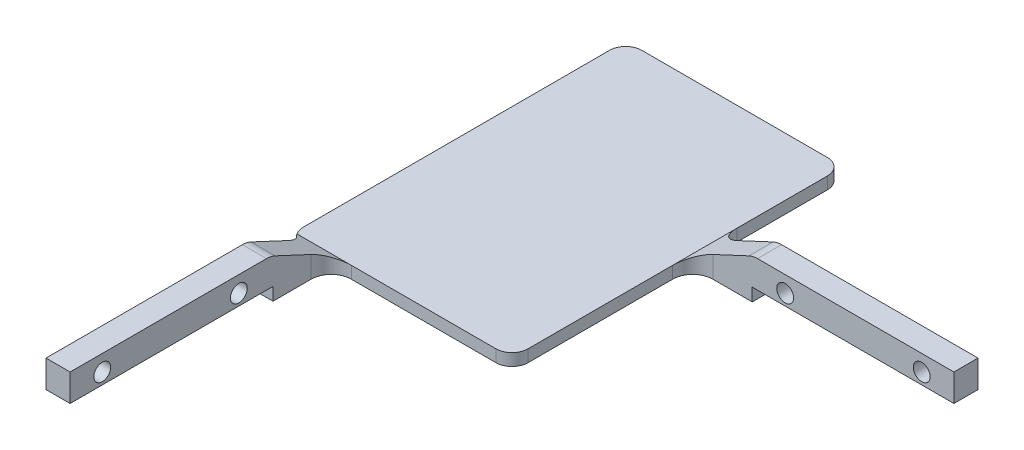
ISO-10303-21;
HEADER;
FILE_DESCRIPTION(('STEP AP214'),'2;1');
FILE_NAME('part.step','',(''),(''),'','','');
FILE_SCHEMA(('AUTOMOTIVE_DESIGN { 1 0 10303 214 1 1 1 1 }'));
ENDSEC;
DATA;
#1=APPLICATION_CONTEXT('core data for automotive mechanical design processes');
#2=APPLICATION_PROTOCOL_DEFINITION('international standard','automotive_design',2000,#1);
#3=PRODUCT_CONTEXT('',#1,'mechanical');
#4=PRODUCT('Part','Part','',(#3));
#5=PRODUCT_RELATED_PRODUCT_CATEGORY('part','',(#4));
#6=PRODUCT_DEFINITION_FORMATION('','',#4);
#7=PRODUCT_DEFINITION_CONTEXT('part definition',#1,'design');
#8=PRODUCT_DEFINITION('design','',#6,#7);
#9=PRODUCT_DEFINITION_SHAPE('','',#8);
#10=(LENGTH_UNIT() NAMED_UNIT(*) SI_UNIT(.MILLI.,.METRE.));
#11=(NAMED_UNIT(*) PLANE_ANGLE_UNIT() SI_UNIT($,.RADIAN.));
#12=(NAMED_UNIT(*) SI_UNIT($,.STERADIAN.) SOLID_ANGLE_UNIT());
#13=UNCERTAINTY_MEASURE_WITH_UNIT(LENGTH_MEASURE(1.E-05),#10,'distance_accuracy_value','');
#14=(GEOMETRIC_REPRESENTATION_CONTEXT(3) GLOBAL_UNCERTAINTY_ASSIGNED_CONTEXT((#13)) GLOBAL_UNIT_ASSIGNED_CONTEXT((#10,
#11,#12)) REPRESENTATION_CONTEXT('',''));
#15=CARTESIAN_POINT('',(0.,0.,0.));
#16=DIRECTION('',(0.,0.,1.));
#17=DIRECTION('',(1.,0.,0.));
#18=AXIS2_PLACEMENT_3D('',#15,#16,#17);
#19=CARTESIAN_POINT('',(0.,-85.2023912995869,0.));
#20=DIRECTION('',(0.,-1.,0.));
#21=DIRECTION('',(0.,0.,-1.));
#22=AXIS2_PLACEMENT_3D('',#19,#20,#21);
#23=PLANE('',#22);
#24=CARTESIAN_POINT('',(-96.,-85.2023912995869,-35.3352384841235));
#25=DIRECTION('',(0.,-1.,0.));
#26=DIRECTION('',(0.,0.,-1.));
#27=AXIS2_PLACEMENT_3D('',#24,#25,#26);
#28=CIRCLE('',#27,5.);
#29=CARTESIAN_POINT('',(-91.,-85.2023912995869,-35.3352384841235));
#30=VERTEX_POINT('',#29);
#31=CARTESIAN_POINT('',(-92.7777777777776,-85.2023912995869,-39.1584941583645));
#32=VERTEX_POINT('',#31);
#33=EDGE_CURVE('E377',#30,#32,#28,.F.);
#34=ORIENTED_EDGE('',*,*,#33,.T.);
#35=CARTESIAN_POINT('',(-90.1999999999996,-85.2023912995869,-42.2170986977573));
#36=DIRECTION('',(0.,-1.,0.));
#37=DIRECTION('',(0.,0.,-1.));
#38=AXIS2_PLACEMENT_3D('',#35,#36,#37);
#39=CIRCLE('',#38,4.);
#40=CARTESIAN_POINT('',(-94.1999999999996,-85.2023912995869,-42.2170986977573));
#41=VERTEX_POINT('',#40);
#42=EDGE_CURVE('E439',#32,#41,#39,.T.);
#43=ORIENTED_EDGE('',*,*,#42,.T.);
#44=DIRECTION('',(0.,0.,-1.));
#45=VECTOR('',#44,1.);
#46=CARTESIAN_POINT('',(-94.1999999999996,-85.2023912995869,0.));
#47=LINE('',#46,#45);
#48=CARTESIAN_POINT('',(-94.1999999999996,-85.2023912995869,-118.5));
#49=VERTEX_POINT('',#48);
#50=EDGE_CURVE('E316',#41,#49,#47,.T.);
#51=ORIENTED_EDGE('',*,*,#50,.T.);
#52=CARTESIAN_POINT('',(-90.1999999999996,-85.2023912995869,-118.5));
#53=DIRECTION('',(0.,-1.,0.));
#54=DIRECTION('',(0.,0.,-1.));
#55=AXIS2_PLACEMENT_3D('',#52,#53,#54);
#56=CIRCLE('',#55,4.);
#57=CARTESIAN_POINT('',(-90.1999999999996,-85.2023912995869,-122.5));
#58=VERTEX_POINT('',#57);
#59=EDGE_CURVE('E49',#49,#58,#56,.T.);
#60=ORIENTED_EDGE('',*,*,#59,.T.);
#61=DIRECTION('',(-1.,0.,0.));
#62=VECTOR('',#61,1.);
#63=CARTESIAN_POINT('',(0.,-85.2023912995869,-122.5));
#64=LINE('',#63,#62);
#65=CARTESIAN_POINT('',(-43.9999999999996,-85.2023912995869,-122.5));
#66=VERTEX_POINT('',#65);
#67=EDGE_CURVE('E308',#66,#58,#64,.T.);
#68=ORIENTED_EDGE('',*,*,#67,.F.);
#69=CARTESIAN_POINT('',(-43.9999999999996,-85.2023912995869,-118.5));
#70=DIRECTION('',(0.,-1.,0.));
#71=DIRECTION('',(0.,0.,-1.));
#72=AXIS2_PLACEMENT_3D('',#69,#70,#71);
#73=CIRCLE('',#72,4.);
#74=CARTESIAN_POINT('',(-39.9999999999996,-85.2023912995869,-118.5));
#75=VERTEX_POINT('',#74);
#76=EDGE_CURVE('E434',#66,#75,#73,.T.);
#77=ORIENTED_EDGE('',*,*,#76,.T.);
#78=DIRECTION('',(0.,0.,-1.));
#79=VECTOR('',#78,1.);
#80=CARTESIAN_POINT('',(-39.9999999999996,-85.2023912995869,0.));
#81=LINE('',#80,#79);
#82=CARTESIAN_POINT('',(-39.9999999999996,-85.2023912995869,-96.));
#83=VERTEX_POINT('',#82);
#84=EDGE_CURVE('E317',#83,#75,#81,.T.);
#85=ORIENTED_EDGE('',*,*,#84,.F.);
#86=CARTESIAN_POINT('',(-34.9999999999996,-85.2023912995869,-96.));
#87=DIRECTION('',(0.,-1.,0.));
#88=DIRECTION('',(0.,0.,-1.));
#89=AXIS2_PLACEMENT_3D('',#86,#87,#88);
#90=CIRCLE('',#89,5.);
#91=CARTESIAN_POINT('',(-34.9999999999996,-85.2023912995869,-91.));
#92=VERTEX_POINT('',#91);
#93=EDGE_CURVE('E388',#83,#92,#90,.F.);
#94=ORIENTED_EDGE('',*,*,#93,.T.);
#95=DIRECTION('',(1.,0.,0.));
#96=VECTOR('',#95,1.);
#97=CARTESIAN_POINT('',(0.,-85.2023912995869,-91.));
#98=LINE('',#97,#96);
#99=CARTESIAN_POINT('',(-25.1999999999996,-85.2023912995869,-91.));
#100=VERTEX_POINT('',#99);
#101=EDGE_CURVE('E297',#92,#100,#98,.T.);
#102=ORIENTED_EDGE('',*,*,#101,.T.);
#103=DIRECTION('',(0.,0.,1.));
#104=VECTOR('',#103,1.);
#105=CARTESIAN_POINT('',(-25.1999999999996,-85.2023912995869,0.));
#106=LINE('',#105,#104);
#107=CARTESIAN_POINT('',(-25.1999999999996,-85.2023912995869,-85.));
#108=VERTEX_POINT('',#107);
#109=EDGE_CURVE('E321',#100,#108,#106,.T.);
#110=ORIENTED_EDGE('',*,*,#109,.T.);
#111=DIRECTION('',(1.,0.,0.));
#112=VECTOR('',#111,1.);
#113=CARTESIAN_POINT('',(0.,-85.2023912995869,-85.));
#114=LINE('',#113,#112);
#115=CARTESIAN_POINT('',(-34.9999999999996,-85.2023912995869,-85.));
#116=VERTEX_POINT('',#115);
#117=EDGE_CURVE('E322',#116,#108,#114,.T.);
#118=ORIENTED_EDGE('',*,*,#117,.F.);
#119=CARTESIAN_POINT('',(-34.9999999999996,-85.2023912995869,-80.));
#120=DIRECTION('',(0.,-1.,0.));
#121=DIRECTION('',(0.,0.,-1.));
#122=AXIS2_PLACEMENT_3D('',#119,#120,#121);
#123=CIRCLE('',#122,5.);
#124=CARTESIAN_POINT('',(-39.9999999999996,-85.2023912995869,-80.));
#125=VERTEX_POINT('',#124);
#126=EDGE_CURVE('E382',#116,#125,#123,.F.);
#127=ORIENTED_EDGE('',*,*,#126,.T.);
#128=DIRECTION('',(0.,0.,-1.));
#129=VECTOR('',#128,1.);
#130=CARTESIAN_POINT('',(-39.9999999999996,-85.2023912995869,0.));
#131=LINE('',#130,#129);
#132=CARTESIAN_POINT('',(-39.9999999999996,-85.2023912995869,-43.9999999999996));
#133=VERTEX_POINT('',#132);
#134=EDGE_CURVE('E303',#133,#125,#131,.T.);
#135=ORIENTED_EDGE('',*,*,#134,.F.);
#136=CARTESIAN_POINT('',(-43.9999999999996,-85.2023912995869,-43.9999999999996));
#137=DIRECTION('',(0.,-1.,0.));
#138=DIRECTION('',(0.,0.,-1.));
#139=AXIS2_PLACEMENT_3D('',#136,#137,#138);
#140=CIRCLE('',#139,4.);
#141=CARTESIAN_POINT('',(-43.9999999999996,-85.2023912995869,-39.9999999999996));
#142=VERTEX_POINT('',#141);
#143=EDGE_CURVE('E436',#133,#142,#140,.T.);
#144=ORIENTED_EDGE('',*,*,#143,.T.);
#145=DIRECTION('',(-1.,0.,0.));
#146=VECTOR('',#145,1.);
#147=CARTESIAN_POINT('',(0.,-85.2023912995869,-39.9999999999996));
#148=LINE('',#147,#146);
#149=CARTESIAN_POINT('',(-80.,-85.2023912995869,-39.9999999999996));
#150=VERTEX_POINT('',#149);
#151=EDGE_CURVE('E326',#142,#150,#148,.T.);
#152=ORIENTED_EDGE('',*,*,#151,.T.);
#153=CARTESIAN_POINT('',(-80.,-85.2023912995869,-34.9999999999996));
#154=DIRECTION('',(0.,-1.,0.));
#155=DIRECTION('',(0.,0.,-1.));
#156=AXIS2_PLACEMENT_3D('',#153,#154,#155);
#157=CIRCLE('',#156,5.);
#158=CARTESIAN_POINT('',(-85.,-85.2023912995869,-34.9999999999996));
#159=VERTEX_POINT('',#158);
#160=EDGE_CURVE('E373',#150,#159,#157,.F.);
#161=ORIENTED_EDGE('',*,*,#160,.T.);
#162=DIRECTION('',(0.,0.,-1.));
#163=VECTOR('',#162,1.);
#164=CARTESIAN_POINT('',(-85.,-85.2023912995869,0.));
#165=LINE('',#164,#163);
#166=CARTESIAN_POINT('',(-85.,-85.2023912995869,-25.4999999999996));
#167=VERTEX_POINT('',#166);
#168=EDGE_CURVE('E304',#167,#159,#165,.T.);
#169=ORIENTED_EDGE('',*,*,#168,.F.);
#170=DIRECTION('',(-1.,0.,0.));
#171=VECTOR('',#170,1.);
#172=CARTESIAN_POINT('',(0.,-85.2023912995869,-25.4999999999996));
#173=LINE('',#172,#171);
#174=CARTESIAN_POINT('',(-91.,-85.2023912995869,-25.4999999999996));
#175=VERTEX_POINT('',#174);
#176=EDGE_CURVE('E291',#167,#175,#173,.T.);
#177=ORIENTED_EDGE('',*,*,#176,.T.);
#178=DIRECTION('',(0.,0.,-1.));
#179=VECTOR('',#178,1.);
#180=CARTESIAN_POINT('',(-91.,-85.2023912995869,0.));
#181=LINE('',#180,#179);
#182=EDGE_CURVE('E328',#175,#30,#181,.T.);
#183=ORIENTED_EDGE('',*,*,#182,.T.);
#184=EDGE_LOOP('',(#34,#43,#51,#60,#68,#77,#85,#94,#102,#110,#118,#127,#135,#144,#152,#161,#169,
#177,#183));
#185=FACE_BOUND('',#184,.T.);
#186=ADVANCED_FACE('F34',(#185),#23,.T.);
#187=CARTESIAN_POINT('',(0.,-82.2023912995869,0.));
#188=DIRECTION('',(0.,1.,0.));
#189=DIRECTION('',(0.,0.,1.));
#190=AXIS2_PLACEMENT_3D('',#187,#188,#189);
#191=PLANE('',#190);
#192=DIRECTION('',(0.,0.,-1.));
#193=VECTOR('',#192,1.);
#194=CARTESIAN_POINT('',(-94.1999999999996,-82.2023912995869,0.));
#195=LINE('',#194,#193);
#196=CARTESIAN_POINT('',(-94.1999999999996,-82.2023912995869,-42.2170986977573));
#197=VERTEX_POINT('',#196);
#198=CARTESIAN_POINT('',(-94.1999999999996,-82.2023912995869,-118.5));
#199=VERTEX_POINT('',#198);
#200=EDGE_CURVE('E305',#197,#199,#195,.T.);
#201=ORIENTED_EDGE('',*,*,#200,.F.);
#202=CARTESIAN_POINT('',(-90.1999999999996,-82.2023912995869,-42.2170986977573));
#203=DIRECTION('',(0.,1.,0.));
#204=DIRECTION('',(0.,0.,1.));
#205=AXIS2_PLACEMENT_3D('',#202,#203,#204);
#206=CIRCLE('',#205,4.);
#207=CARTESIAN_POINT('',(-93.5293352736543,-82.2023912995869,-39.9999999999996));
#208=VERTEX_POINT('',#207);
#209=EDGE_CURVE('E428',#197,#208,#206,.T.);
#210=ORIENTED_EDGE('',*,*,#209,.T.);
#211=DIRECTION('',(-1.,0.,0.));
#212=VECTOR('',#211,1.);
#213=CARTESIAN_POINT('',(0.,-82.2023912995869,-39.9999999999996));
#214=LINE('',#213,#212);
#215=CARTESIAN_POINT('',(-80.,-82.2023912995869,-39.9999999999996));
#216=VERTEX_POINT('',#215);
#217=EDGE_CURVE('E295',#216,#208,#214,.T.);
#218=ORIENTED_EDGE('',*,*,#217,.F.);
#219=DIRECTION('',(-1.,0.,0.));
#220=VECTOR('',#219,1.);
#221=CARTESIAN_POINT('',(0.,-82.2023912995869,-39.9999999999996));
#222=LINE('',#221,#220);
#223=CARTESIAN_POINT('',(-43.9999999999996,-82.2023912995869,-39.9999999999996));
#224=VERTEX_POINT('',#223);
#225=EDGE_CURVE('E301',#224,#216,#222,.T.);
#226=ORIENTED_EDGE('',*,*,#225,.F.);
#227=CARTESIAN_POINT('',(-43.9999999999996,-82.2023912995869,-43.9999999999996));
#228=DIRECTION('',(0.,1.,0.));
#229=DIRECTION('',(0.,0.,1.));
#230=AXIS2_PLACEMENT_3D('',#227,#228,#229);
#231=CIRCLE('',#230,4.);
#232=CARTESIAN_POINT('',(-39.9999999999996,-82.2023912995869,-43.9999999999996));
#233=VERTEX_POINT('',#232);
#234=EDGE_CURVE('E424',#224,#233,#231,.T.);
#235=ORIENTED_EDGE('',*,*,#234,.T.);
#236=DIRECTION('',(0.,0.,-1.));
#237=VECTOR('',#236,1.);
#238=CARTESIAN_POINT('',(-39.9999999999996,-82.2023912995869,0.));
#239=LINE('',#238,#237);
#240=CARTESIAN_POINT('',(-39.9999999999996,-82.2023912995869,-80.));
#241=VERTEX_POINT('',#240);
#242=EDGE_CURVE('E312',#233,#241,#239,.T.);
#243=ORIENTED_EDGE('',*,*,#242,.T.);
#244=DIRECTION('',(0.,0.,-1.));
#245=VECTOR('',#244,1.);
#246=CARTESIAN_POINT('',(-39.9999999999996,-82.2023912995869,0.));
#247=LINE('',#246,#245);
#248=CARTESIAN_POINT('',(-39.9999999999996,-82.2023912995869,-96.));
#249=VERTEX_POINT('',#248);
#250=EDGE_CURVE('E233',#241,#249,#247,.T.);
#251=ORIENTED_EDGE('',*,*,#250,.T.);
#252=CARTESIAN_POINT('',(-39.9999999999996,-82.2023912995869,-118.5));
#253=VERTEX_POINT('',#252);
#254=EDGE_CURVE('E313',#249,#253,#239,.T.);
#255=ORIENTED_EDGE('',*,*,#254,.T.);
#256=CARTESIAN_POINT('',(-43.9999999999996,-82.2023912995869,-118.5));
#257=DIRECTION('',(0.,1.,0.));
#258=DIRECTION('',(0.,0.,1.));
#259=AXIS2_PLACEMENT_3D('',#256,#257,#258);
#260=CIRCLE('',#259,4.);
#261=CARTESIAN_POINT('',(-43.9999999999996,-82.2023912995869,-122.5));
#262=VERTEX_POINT('',#261);
#263=EDGE_CURVE('E422',#253,#262,#260,.T.);
#264=ORIENTED_EDGE('',*,*,#263,.T.);
#265=DIRECTION('',(-1.,0.,0.));
#266=VECTOR('',#265,1.);
#267=CARTESIAN_POINT('',(0.,-82.2023912995869,-122.5));
#268=LINE('',#267,#266);
#269=CARTESIAN_POINT('',(-90.1999999999996,-82.2023912995869,-122.5));
#270=VERTEX_POINT('',#269);
#271=EDGE_CURVE('E309',#262,#270,#268,.T.);
#272=ORIENTED_EDGE('',*,*,#271,.T.);
#273=CARTESIAN_POINT('',(-90.1999999999996,-82.2023912995869,-118.5));
#274=DIRECTION('',(0.,1.,0.));
#275=DIRECTION('',(0.,0.,1.));
#276=AXIS2_PLACEMENT_3D('',#273,#274,#275);
#277=CIRCLE('',#276,4.);
#278=EDGE_CURVE('E426',#270,#199,#277,.T.);
#279=ORIENTED_EDGE('',*,*,#278,.T.);
#280=EDGE_LOOP('',(#201,#210,#218,#226,#235,#243,#251,#255,#264,#272,#279));
#281=FACE_BOUND('',#280,.T.);
#282=ADVANCED_FACE('F466',(#281),#191,.T.);
#283=CARTESIAN_POINT('',(-39.9999999999996,-197.161414906238,0.));
#284=DIRECTION('',(1.,0.,0.));
#285=DIRECTION('',(0.,0.,-1.));
#286=AXIS2_PLACEMENT_3D('',#283,#284,#285);
#287=PLANE('',#286);
#288=ORIENTED_EDGE('',*,*,#84,.T.);
#289=DIRECTION('',(0.,1.,0.));
#290=VECTOR('',#289,1.);
#291=CARTESIAN_POINT('',(-39.9999999999996,-197.161414906238,-118.5));
#292=LINE('',#291,#290);
#293=EDGE_CURVE('E11',#75,#253,#292,.T.);
#294=ORIENTED_EDGE('',*,*,#293,.T.);
#295=ORIENTED_EDGE('',*,*,#254,.F.);
#296=DIRECTION('',(0.,1.,0.));
#297=VECTOR('',#296,1.);
#298=CARTESIAN_POINT('',(-39.9999999999996,-197.161414906238,-96.));
#299=LINE('',#298,#297);
#300=EDGE_CURVE('E359',#249,#83,#299,.F.);
#301=ORIENTED_EDGE('',*,*,#300,.T.);
#302=EDGE_LOOP('',(#288,#294,#295,#301));
#303=FACE_BOUND('',#302,.T.);
#304=ADVANCED_FACE('F512',(#303),#287,.T.);
#305=CARTESIAN_POINT('',(0.,-197.161414906238,-122.5));
#306=DIRECTION('',(0.,0.,-1.));
#307=DIRECTION('',(-1.,0.,0.));
#308=AXIS2_PLACEMENT_3D('',#305,#306,#307);
#309=PLANE('',#308);
#310=ORIENTED_EDGE('',*,*,#67,.T.);
#311=DIRECTION('',(0.,1.,0.));
#312=VECTOR('',#311,1.);
#313=CARTESIAN_POINT('',(-90.1999999999996,-82.2023912995869,-122.5));
#314=LINE('',#313,#312);
#315=EDGE_CURVE('E442',#58,#270,#314,.T.);
#316=ORIENTED_EDGE('',*,*,#315,.T.);
#317=ORIENTED_EDGE('',*,*,#271,.F.);
#318=DIRECTION('',(0.,1.,0.));
#319=VECTOR('',#318,1.);
#320=CARTESIAN_POINT('',(-43.9999999999996,-197.161414906238,-122.5));
#321=LINE('',#320,#319);
#322=EDGE_CURVE('E56',#262,#66,#321,.F.);
#323=ORIENTED_EDGE('',*,*,#322,.T.);
#324=EDGE_LOOP('',(#310,#316,#317,#323));
#325=FACE_BOUND('',#324,.T.);
#326=ADVANCED_FACE('F506',(#325),#309,.T.);
#327=CARTESIAN_POINT('',(-94.1999999999996,-197.161414906238,0.));
#328=DIRECTION('',(1.,0.,0.));
#329=DIRECTION('',(0.,0.,-1.));
#330=AXIS2_PLACEMENT_3D('',#327,#328,#329);
#331=PLANE('',#330);
#332=ORIENTED_EDGE('',*,*,#50,.F.);
#333=DIRECTION('',(0.,-1.,0.));
#334=VECTOR('',#333,1.);
#335=CARTESIAN_POINT('',(-94.1999999999996,-197.161414906238,-42.2170986977573));
#336=LINE('',#335,#334);
#337=EDGE_CURVE('E419',#41,#197,#336,.F.);
#338=ORIENTED_EDGE('',*,*,#337,.T.);
#339=ORIENTED_EDGE('',*,*,#200,.T.);
#340=DIRECTION('',(0.,1.,0.));
#341=VECTOR('',#340,1.);
#342=CARTESIAN_POINT('',(-94.1999999999996,-85.2023912995869,-118.5));
#343=LINE('',#342,#341);
#344=EDGE_CURVE('E390',#199,#49,#343,.F.);
#345=ORIENTED_EDGE('',*,*,#344,.T.);
#346=EDGE_LOOP('',(#332,#338,#339,#345));
#347=FACE_BOUND('',#346,.T.);
#348=ADVANCED_FACE('F501',(#347),#331,.F.);
#349=CARTESIAN_POINT('',(-91.,-197.161414906238,0.));
#350=DIRECTION('',(1.,0.,0.));
#351=DIRECTION('',(0.,0.,-1.));
#352=AXIS2_PLACEMENT_3D('',#349,#350,#351);
#353=PLANE('',#352);
#354=DIRECTION('',(0.,0.422885465331124,0.906183139995265));
#355=VECTOR('',#354,1.);
#356=CARTESIAN_POINT('',(-91.,-82.2023912995869,-39.9999999999996));
#357=LINE('',#356,#355);
#358=CARTESIAN_POINT('',(-91.,-80.0255025921781,-35.3352384841235));
#359=VERTEX_POINT('',#358);
#360=CARTESIAN_POINT('',(-91.,-75.6714755996106,-26.0051806429075));
#361=VERTEX_POINT('',#360);
#362=EDGE_CURVE('E543',#359,#361,#357,.T.);
#363=ORIENTED_EDGE('',*,*,#362,.F.);
#364=DIRECTION('',(0.,-1.,0.));
#365=VECTOR('',#364,1.);
#366=CARTESIAN_POINT('',(-91.,-197.161414906238,-35.3352384841235));
#367=LINE('',#366,#365);
#368=EDGE_CURVE('E346',#359,#30,#367,.T.);
#369=ORIENTED_EDGE('',*,*,#368,.T.);
#370=ORIENTED_EDGE('',*,*,#182,.F.);
#371=DIRECTION('',(0.,1.,0.));
#372=VECTOR('',#371,1.);
#373=CARTESIAN_POINT('',(-91.,-197.161414906238,-25.4999999999996));
#374=LINE('',#373,#372);
#375=CARTESIAN_POINT('',(-91.,-82.0023912995869,-25.4999999999996));
#376=VERTEX_POINT('',#375);
#377=EDGE_CURVE('E408',#175,#376,#374,.T.);
#378=ORIENTED_EDGE('',*,*,#377,.T.);
#379=DIRECTION('',(0.,0.,-1.));
#380=VECTOR('',#379,1.);
#381=CARTESIAN_POINT('',(-91.,-82.0023912995869,0.));
#382=LINE('',#381,#380);
#383=CARTESIAN_POINT('',(-91.,-82.0023912995869,24.9999999999996));
#384=VERTEX_POINT('',#383);
#385=EDGE_CURVE('E411',#384,#376,#382,.T.);
#386=ORIENTED_EDGE('',*,*,#385,.F.);
#387=DIRECTION('',(0.,-1.,0.));
#388=VECTOR('',#387,1.);
#389=CARTESIAN_POINT('',(-91.,-8.93022519646421,24.9999999999996));
#390=LINE('',#389,#388);
#391=CARTESIAN_POINT('',(-91.,-75.2023912995869,24.9999999999996));
#392=VERTEX_POINT('',#391);
#393=EDGE_CURVE('E285',#392,#384,#390,.T.);
#394=ORIENTED_EDGE('',*,*,#393,.F.);
#395=DIRECTION('',(0.,0.,1.));
#396=VECTOR('',#395,1.);
#397=CARTESIAN_POINT('',(-91.,-75.2023912995869,0.));
#398=LINE('',#397,#396);
#399=CARTESIAN_POINT('',(-91.,-75.2023912995869,-23.8907533162518));
#400=VERTEX_POINT('',#399);
#401=EDGE_CURVE('E294',#400,#392,#398,.T.);
#402=ORIENTED_EDGE('',*,*,#401,.F.);
#403=CARTESIAN_POINT('',(-91.,-80.2023912995869,-23.8907533162518));
#404=DIRECTION('',(1.,0.,0.));
#405=DIRECTION('',(0.,0.,-1.));
#406=AXIS2_PLACEMENT_3D('',#403,#404,#405);
#407=CIRCLE('',#406,5.);
#408=EDGE_CURVE('E344',#400,#361,#407,.F.);
#409=ORIENTED_EDGE('',*,*,#408,.T.);
#410=EDGE_LOOP('',(#363,#369,#370,#378,#386,#394,#402,#409));
#411=FACE_BOUND('',#410,.T.);
#412=CARTESIAN_POINT('',(-91.,-79.2023912995869,-17.0000000000003));
#413=DIRECTION('',(-1.,0.,0.));
#414=DIRECTION('',(0.,0.,1.));
#415=AXIS2_PLACEMENT_3D('',#412,#413,#414);
#416=CIRCLE('',#415,2.1);
#417=CARTESIAN_POINT('',(-91.,-79.2023912995869,-14.9000000000003));
#418=VERTEX_POINT('',#417);
#419=EDGE_CURVE('E271',#418,#418,#416,.T.);
#420=ORIENTED_EDGE('',*,*,#419,.F.);
#421=EDGE_LOOP('',(#420));
#422=FACE_BOUND('',#421,.T.);
#423=CARTESIAN_POINT('',(-91.,-79.2023912995869,16.9999999999997));
#424=DIRECTION('',(-1.,0.,0.));
#425=DIRECTION('',(0.,0.,1.));
#426=AXIS2_PLACEMENT_3D('',#423,#424,#425);
#427=CIRCLE('',#426,2.1);
#428=CARTESIAN_POINT('',(-91.,-79.2023912995869,19.0999999999997));
#429=VERTEX_POINT('',#428);
#430=EDGE_CURVE('E268',#429,#429,#427,.T.);
#431=ORIENTED_EDGE('',*,*,#430,.F.);
#432=EDGE_LOOP('',(#431));
#433=FACE_BOUND('',#432,.T.);
#434=ADVANCED_FACE('F566',(#411,#422,#433),#353,.F.);
#435=CARTESIAN_POINT('',(-85.,-197.161414906238,0.));
#436=DIRECTION('',(1.,0.,0.));
#437=DIRECTION('',(0.,0.,-1.));
#438=AXIS2_PLACEMENT_3D('',#435,#436,#437);
#439=PLANE('',#438);
#440=ORIENTED_EDGE('',*,*,#168,.T.);
#441=DIRECTION('',(0.,1.,0.));
#442=VECTOR('',#441,1.);
#443=CARTESIAN_POINT('',(-85.,-197.161414906238,-34.9999999999996));
#444=LINE('',#443,#442);
#445=CARTESIAN_POINT('',(-85.,-79.8690579662536,-34.9999999999996));
#446=VERTEX_POINT('',#445);
#447=EDGE_CURVE('E337',#159,#446,#444,.T.);
#448=ORIENTED_EDGE('',*,*,#447,.T.);
#449=DIRECTION('',(0.,0.422885465331124,0.906183139995265));
#450=VECTOR('',#449,1.);
#451=CARTESIAN_POINT('',(-85.,-82.2023912995869,-39.9999999999996));
#452=LINE('',#451,#450);
#453=CARTESIAN_POINT('',(-85.,-75.6714755996106,-26.0051806429075));
#454=VERTEX_POINT('',#453);
#455=EDGE_CURVE('E473',#446,#454,#452,.T.);
#456=ORIENTED_EDGE('',*,*,#455,.T.);
#457=CARTESIAN_POINT('',(-85.,-80.2023912995869,-23.8907533162518));
#458=DIRECTION('',(1.,0.,0.));
#459=DIRECTION('',(0.,0.,-1.));
#460=AXIS2_PLACEMENT_3D('',#457,#458,#459);
#461=CIRCLE('',#460,5.);
#462=CARTESIAN_POINT('',(-85.,-75.2023912995869,-23.8907533162518));
#463=VERTEX_POINT('',#462);
#464=EDGE_CURVE('E335',#454,#463,#461,.T.);
#465=ORIENTED_EDGE('',*,*,#464,.T.);
#466=DIRECTION('',(0.,0.,1.));
#467=VECTOR('',#466,1.);
#468=CARTESIAN_POINT('',(-85.,-75.2023912995869,0.));
#469=LINE('',#468,#467);
#470=CARTESIAN_POINT('',(-85.,-75.2023912995869,24.9999999999996));
#471=VERTEX_POINT('',#470);
#472=EDGE_CURVE('E292',#463,#471,#469,.T.);
#473=ORIENTED_EDGE('',*,*,#472,.T.);
#474=DIRECTION('',(0.,-1.,0.));
#475=VECTOR('',#474,1.);
#476=CARTESIAN_POINT('',(-85.,-8.93022519646421,24.9999999999996));
#477=LINE('',#476,#475);
#478=CARTESIAN_POINT('',(-85.,-82.0023912995869,24.9999999999996));
#479=VERTEX_POINT('',#478);
#480=EDGE_CURVE('E283',#471,#479,#477,.T.);
#481=ORIENTED_EDGE('',*,*,#480,.T.);
#482=DIRECTION('',(0.,0.,-1.));
#483=VECTOR('',#482,1.);
#484=CARTESIAN_POINT('',(-85.,-82.0023912995869,0.));
#485=LINE('',#484,#483);
#486=CARTESIAN_POINT('',(-85.,-82.0023912995869,-25.4999999999996));
#487=VERTEX_POINT('',#486);
#488=EDGE_CURVE('E278',#479,#487,#485,.T.);
#489=ORIENTED_EDGE('',*,*,#488,.T.);
#490=DIRECTION('',(0.,1.,0.));
#491=VECTOR('',#490,1.);
#492=CARTESIAN_POINT('',(-85.,-197.161414906238,-25.4999999999996));
#493=LINE('',#492,#491);
#494=EDGE_CURVE('E405',#167,#487,#493,.T.);
#495=ORIENTED_EDGE('',*,*,#494,.F.);
#496=EDGE_LOOP('',(#440,#448,#456,#465,#473,#481,#489,#495));
#497=FACE_BOUND('',#496,.T.);
#498=CARTESIAN_POINT('',(-85.,-79.2023912995869,-17.0000000000003));
#499=DIRECTION('',(1.,0.,0.));
#500=DIRECTION('',(0.,0.,-1.));
#501=AXIS2_PLACEMENT_3D('',#498,#499,#500);
#502=CIRCLE('',#501,2.1);
#503=CARTESIAN_POINT('',(-85.,-79.2023912995869,-19.1000000000003));
#504=VERTEX_POINT('',#503);
#505=EDGE_CURVE('E274',#504,#504,#502,.F.);
#506=ORIENTED_EDGE('',*,*,#505,.T.);
#507=EDGE_LOOP('',(#506));
#508=FACE_BOUND('',#507,.T.);
#509=CARTESIAN_POINT('',(-85.,-79.2023912995869,16.9999999999997));
#510=DIRECTION('',(1.,0.,0.));
#511=DIRECTION('',(0.,0.,-1.));
#512=AXIS2_PLACEMENT_3D('',#509,#510,#511);
#513=CIRCLE('',#512,2.1);
#514=CARTESIAN_POINT('',(-85.,-79.2023912995869,14.8999999999997));
#515=VERTEX_POINT('',#514);
#516=EDGE_CURVE('E275',#515,#515,#513,.F.);
#517=ORIENTED_EDGE('',*,*,#516,.T.);
#518=EDGE_LOOP('',(#517));
#519=FACE_BOUND('',#518,.T.);
#520=ADVANCED_FACE('F481',(#497,#508,#519),#439,.T.);
#521=CARTESIAN_POINT('',(0.,-197.161414906238,-39.9999999999996));
#522=DIRECTION('',(0.,0.,-1.));
#523=DIRECTION('',(-1.,0.,0.));
#524=AXIS2_PLACEMENT_3D('',#521,#522,#523);
#525=PLANE('',#524);
#526=ORIENTED_EDGE('',*,*,#151,.F.);
#527=DIRECTION('',(0.,1.,0.));
#528=VECTOR('',#527,1.);
#529=CARTESIAN_POINT('',(-43.9999999999996,-82.2023912995869,-39.9999999999996));
#530=LINE('',#529,#528);
#531=EDGE_CURVE('E445',#142,#224,#530,.T.);
#532=ORIENTED_EDGE('',*,*,#531,.T.);
#533=ORIENTED_EDGE('',*,*,#225,.T.);
#534=DIRECTION('',(0.,1.,0.));
#535=VECTOR('',#534,1.);
#536=CARTESIAN_POINT('',(-80.,-197.161414906238,-39.9999999999996));
#537=LINE('',#536,#535);
#538=EDGE_CURVE('E341',#216,#150,#537,.F.);
#539=ORIENTED_EDGE('',*,*,#538,.T.);
#540=EDGE_LOOP('',(#526,#532,#533,#539));
#541=FACE_BOUND('',#540,.T.);
#542=ADVANCED_FACE('F462',(#541),#525,.F.);
#543=ORIENTED_EDGE('',*,*,#242,.F.);
#544=DIRECTION('',(0.,1.,0.));
#545=VECTOR('',#544,1.);
#546=CARTESIAN_POINT('',(-39.9999999999996,-85.2023912995869,-43.9999999999996));
#547=LINE('',#546,#545);
#548=EDGE_CURVE('E42',#233,#133,#547,.F.);
#549=ORIENTED_EDGE('',*,*,#548,.T.);
#550=ORIENTED_EDGE('',*,*,#134,.T.);
#551=DIRECTION('',(0.,1.,0.));
#552=VECTOR('',#551,1.);
#553=CARTESIAN_POINT('',(-39.9999999999996,-82.2023912995869,-80.));
#554=LINE('',#553,#552);
#555=EDGE_CURVE('E348',#125,#241,#554,.T.);
#556=ORIENTED_EDGE('',*,*,#555,.T.);
#557=EDGE_LOOP('',(#543,#549,#550,#556));
#558=FACE_BOUND('',#557,.T.);
#559=ADVANCED_FACE('F451',(#558),#287,.T.);
#560=CARTESIAN_POINT('',(0.,-197.161414906238,-85.));
#561=DIRECTION('',(0.,0.,1.));
#562=DIRECTION('',(1.,0.,0.));
#563=AXIS2_PLACEMENT_3D('',#560,#561,#562);
#564=PLANE('',#563);
#565=DIRECTION('',(0.906183139995265,0.422885465331124,0.));
#566=VECTOR('',#565,1.);
#567=CARTESIAN_POINT('',(-39.9999999999996,-82.2023912995869,-85.));
#568=LINE('',#567,#566);
#569=CARTESIAN_POINT('',(-34.9999999999996,-79.8690579662536,-85.));
#570=VERTEX_POINT('',#569);
#571=CARTESIAN_POINT('',(-26.0051806429075,-75.6714755996106,-85.));
#572=VERTEX_POINT('',#571);
#573=EDGE_CURVE('E249',#570,#572,#568,.T.);
#574=ORIENTED_EDGE('',*,*,#573,.F.);
#575=DIRECTION('',(0.,1.,0.));
#576=VECTOR('',#575,1.);
#577=CARTESIAN_POINT('',(-34.9999999999996,-85.2023912995869,-85.));
#578=LINE('',#577,#576);
#579=EDGE_CURVE('E353',#570,#116,#578,.F.);
#580=ORIENTED_EDGE('',*,*,#579,.T.);
#581=ORIENTED_EDGE('',*,*,#117,.T.);
#582=DIRECTION('',(0.,1.,0.));
#583=VECTOR('',#582,1.);
#584=CARTESIAN_POINT('',(-25.1999999999996,-197.161414906238,-85.));
#585=LINE('',#584,#583);
#586=CARTESIAN_POINT('',(-25.1999999999996,-82.0023912995869,-85.));
#587=VERTEX_POINT('',#586);
#588=EDGE_CURVE('E324',#108,#587,#585,.T.);
#589=ORIENTED_EDGE('',*,*,#588,.T.);
#590=DIRECTION('',(1.,0.,0.));
#591=VECTOR('',#590,1.);
#592=CARTESIAN_POINT('',(0.,-82.0023912995869,-85.));
#593=LINE('',#592,#591);
#594=CARTESIAN_POINT('',(24.9999999999996,-82.0023912995869,-85.));
#595=VERTEX_POINT('',#594);
#596=EDGE_CURVE('E265',#587,#595,#593,.T.);
#597=ORIENTED_EDGE('',*,*,#596,.T.);
#598=DIRECTION('',(0.,-1.,0.));
#599=VECTOR('',#598,1.);
#600=CARTESIAN_POINT('',(24.9999999999996,-8.93022519646421,-85.));
#601=LINE('',#600,#599);
#602=CARTESIAN_POINT('',(24.9999999999996,-75.2023912995869,-85.));
#603=VERTEX_POINT('',#602);
#604=EDGE_CURVE('E253',#603,#595,#601,.T.);
#605=ORIENTED_EDGE('',*,*,#604,.F.);
#606=DIRECTION('',(-1.,0.,0.));
#607=VECTOR('',#606,1.);
#608=CARTESIAN_POINT('',(0.,-75.2023912995869,-85.));
#609=LINE('',#608,#607);
#610=CARTESIAN_POINT('',(-23.8907533162519,-75.2023912995869,-85.));
#611=VERTEX_POINT('',#610);
#612=EDGE_CURVE('E232',#603,#611,#609,.T.);
#613=ORIENTED_EDGE('',*,*,#612,.T.);
#614=CARTESIAN_POINT('',(-23.8907533162519,-80.2023912995869,-85.));
#615=DIRECTION('',(0.,0.,1.));
#616=DIRECTION('',(1.,0.,0.));
#617=AXIS2_PLACEMENT_3D('',#614,#615,#616);
#618=CIRCLE('',#617,5.);
#619=EDGE_CURVE('E351',#611,#572,#618,.T.);
#620=ORIENTED_EDGE('',*,*,#619,.T.);
#621=EDGE_LOOP('',(#574,#580,#581,#589,#597,#605,#613,#620));
#622=FACE_BOUND('',#621,.T.);
#623=CARTESIAN_POINT('',(-17.,-79.2023912995869,-85.));
#624=DIRECTION('',(0.,0.,-1.));
#625=DIRECTION('',(-1.,0.,0.));
#626=AXIS2_PLACEMENT_3D('',#623,#624,#625);
#627=CIRCLE('',#626,2.1);
#628=CARTESIAN_POINT('',(-19.1,-79.2023912995869,-85.));
#629=VERTEX_POINT('',#628);
#630=EDGE_CURVE('E260',#629,#629,#627,.F.);
#631=ORIENTED_EDGE('',*,*,#630,.F.);
#632=EDGE_LOOP('',(#631));
#633=FACE_BOUND('',#632,.T.);
#634=CARTESIAN_POINT('',(17.,-79.2023912995869,-85.));
#635=DIRECTION('',(0.,0.,-1.));
#636=DIRECTION('',(-1.,0.,0.));
#637=AXIS2_PLACEMENT_3D('',#634,#635,#636);
#638=CIRCLE('',#637,2.1);
#639=CARTESIAN_POINT('',(14.9,-79.2023912995869,-85.));
#640=VERTEX_POINT('',#639);
#641=EDGE_CURVE('E254',#640,#640,#638,.F.);
#642=ORIENTED_EDGE('',*,*,#641,.F.);
#643=EDGE_LOOP('',(#642));
#644=FACE_BOUND('',#643,.T.);
#645=ADVANCED_FACE('F529',(#622,#633,#644),#564,.T.);
#646=CARTESIAN_POINT('',(-25.1999999999996,-197.161414906238,0.));
#647=DIRECTION('',(-1.,0.,0.));
#648=DIRECTION('',(0.,0.,1.));
#649=AXIS2_PLACEMENT_3D('',#646,#647,#648);
#650=PLANE('',#649);
#651=ORIENTED_EDGE('',*,*,#109,.F.);
#652=DIRECTION('',(0.,1.,0.));
#653=VECTOR('',#652,1.);
#654=CARTESIAN_POINT('',(-25.1999999999996,-197.161414906238,-91.));
#655=LINE('',#654,#653);
#656=CARTESIAN_POINT('',(-25.1999999999996,-82.0023912995869,-91.));
#657=VERTEX_POINT('',#656);
#658=EDGE_CURVE('E393',#100,#657,#655,.T.);
#659=ORIENTED_EDGE('',*,*,#658,.T.);
#660=DIRECTION('',(0.,0.,1.));
#661=VECTOR('',#660,1.);
#662=CARTESIAN_POINT('',(-25.1999999999996,-82.0023912995869,0.));
#663=LINE('',#662,#661);
#664=EDGE_CURVE('E338',#657,#587,#663,.T.);
#665=ORIENTED_EDGE('',*,*,#664,.T.);
#666=ORIENTED_EDGE('',*,*,#588,.F.);
#667=EDGE_LOOP('',(#651,#659,#665,#666));
#668=FACE_BOUND('',#667,.T.);
#669=ADVANCED_FACE('F537',(#668),#650,.F.);
#670=CARTESIAN_POINT('',(0.,-197.161414906238,-91.));
#671=DIRECTION('',(0.,0.,1.));
#672=DIRECTION('',(1.,0.,0.));
#673=AXIS2_PLACEMENT_3D('',#670,#671,#672);
#674=PLANE('',#673);
#675=ORIENTED_EDGE('',*,*,#101,.F.);
#676=DIRECTION('',(0.,1.,0.));
#677=VECTOR('',#676,1.);
#678=CARTESIAN_POINT('',(-34.9999999999996,-197.161414906238,-91.));
#679=LINE('',#678,#677);
#680=CARTESIAN_POINT('',(-34.9999999999996,-79.8690579662536,-91.));
#681=VERTEX_POINT('',#680);
#682=EDGE_CURVE('E356',#92,#681,#679,.T.);
#683=ORIENTED_EDGE('',*,*,#682,.T.);
#684=DIRECTION('',(-0.906183139995265,-0.422885465331124,0.));
#685=VECTOR('',#684,1.);
#686=CARTESIAN_POINT('',(-39.9999999999996,-82.2023912995869,-91.));
#687=LINE('',#686,#685);
#688=CARTESIAN_POINT('',(-26.0051806429075,-75.6714755996106,-91.));
#689=VERTEX_POINT('',#688);
#690=EDGE_CURVE('E246',#689,#681,#687,.T.);
#691=ORIENTED_EDGE('',*,*,#690,.F.);
#692=CARTESIAN_POINT('',(-23.8907533162519,-80.2023912995869,-91.));
#693=DIRECTION('',(0.,0.,1.));
#694=DIRECTION('',(1.,0.,0.));
#695=AXIS2_PLACEMENT_3D('',#692,#693,#694);
#696=CIRCLE('',#695,5.);
#697=CARTESIAN_POINT('',(-23.8907533162519,-75.2023912995869,-91.));
#698=VERTEX_POINT('',#697);
#699=EDGE_CURVE('E228',#689,#698,#696,.F.);
#700=ORIENTED_EDGE('',*,*,#699,.T.);
#701=DIRECTION('',(-1.,0.,0.));
#702=VECTOR('',#701,1.);
#703=CARTESIAN_POINT('',(0.,-75.2023912995869,-91.));
#704=LINE('',#703,#702);
#705=CARTESIAN_POINT('',(24.9999999999996,-75.2023912995869,-91.));
#706=VERTEX_POINT('',#705);
#707=EDGE_CURVE('E218',#706,#698,#704,.T.);
#708=ORIENTED_EDGE('',*,*,#707,.F.);
#709=DIRECTION('',(0.,-1.,0.));
#710=VECTOR('',#709,1.);
#711=CARTESIAN_POINT('',(24.9999999999996,-8.93022519646421,-91.));
#712=LINE('',#711,#710);
#713=CARTESIAN_POINT('',(24.9999999999996,-82.0023912995869,-91.));
#714=VERTEX_POINT('',#713);
#715=EDGE_CURVE('E224',#706,#714,#712,.T.);
#716=ORIENTED_EDGE('',*,*,#715,.T.);
#717=DIRECTION('',(1.,0.,0.));
#718=VECTOR('',#717,1.);
#719=CARTESIAN_POINT('',(0.,-82.0023912995869,-91.));
#720=LINE('',#719,#718);
#721=EDGE_CURVE('E270',#657,#714,#720,.T.);
#722=ORIENTED_EDGE('',*,*,#721,.F.);
#723=ORIENTED_EDGE('',*,*,#658,.F.);
#724=EDGE_LOOP('',(#675,#683,#691,#700,#708,#716,#722,#723));
#725=FACE_BOUND('',#724,.T.);
#726=CARTESIAN_POINT('',(-17.,-79.2023912995869,-91.));
#727=DIRECTION('',(0.,0.,-1.));
#728=DIRECTION('',(-1.,0.,0.));
#729=AXIS2_PLACEMENT_3D('',#726,#727,#728);
#730=CIRCLE('',#729,2.1);
#731=CARTESIAN_POINT('',(-19.1,-79.2023912995869,-91.));
#732=VERTEX_POINT('',#731);
#733=EDGE_CURVE('E263',#732,#732,#730,.T.);
#734=ORIENTED_EDGE('',*,*,#733,.F.);
#735=EDGE_LOOP('',(#734));
#736=FACE_BOUND('',#735,.T.);
#737=CARTESIAN_POINT('',(17.,-79.2023912995869,-91.));
#738=DIRECTION('',(0.,0.,-1.));
#739=DIRECTION('',(-1.,0.,0.));
#740=AXIS2_PLACEMENT_3D('',#737,#738,#739);
#741=CIRCLE('',#740,2.1);
#742=CARTESIAN_POINT('',(14.9,-79.2023912995869,-91.));
#743=VERTEX_POINT('',#742);
#744=EDGE_CURVE('E257',#743,#743,#741,.T.);
#745=ORIENTED_EDGE('',*,*,#744,.F.);
#746=EDGE_LOOP('',(#745));
#747=FACE_BOUND('',#746,.T.);
#748=ADVANCED_FACE('F221',(#725,#736,#747),#674,.F.);
#749=CARTESIAN_POINT('',(0.,-75.2023912995869,0.));
#750=DIRECTION('',(0.,-1.,0.));
#751=DIRECTION('',(0.,0.,1.));
#752=AXIS2_PLACEMENT_3D('',#749,#750,#751);
#753=PLANE('',#752);
#754=ORIENTED_EDGE('',*,*,#472,.F.);
#755=DIRECTION('',(-1.,0.,0.));
#756=VECTOR('',#755,1.);
#757=CARTESIAN_POINT('',(0.,-75.2023912995869,-23.8907533162518));
#758=LINE('',#757,#756);
#759=EDGE_CURVE('E361',#463,#400,#758,.T.);
#760=ORIENTED_EDGE('',*,*,#759,.T.);
#761=ORIENTED_EDGE('',*,*,#401,.T.);
#762=DIRECTION('',(-1.,0.,0.));
#763=VECTOR('',#762,1.);
#764=CARTESIAN_POINT('',(0.,-75.2023912995869,24.9999999999996));
#765=LINE('',#764,#763);
#766=EDGE_CURVE('E288',#471,#392,#765,.T.);
#767=ORIENTED_EDGE('',*,*,#766,.F.);
#768=EDGE_LOOP('',(#754,#760,#761,#767));
#769=FACE_BOUND('',#768,.T.);
#770=ADVANCED_FACE('F556',(#769),#753,.F.);
#771=CARTESIAN_POINT('',(0.,-8.93022519646421,24.9999999999996));
#772=DIRECTION('',(0.,0.,-1.));
#773=DIRECTION('',(-1.,0.,0.));
#774=AXIS2_PLACEMENT_3D('',#771,#772,#773);
#775=PLANE('',#774);
#776=ORIENTED_EDGE('',*,*,#480,.F.);
#777=ORIENTED_EDGE('',*,*,#766,.T.);
#778=ORIENTED_EDGE('',*,*,#393,.T.);
#779=DIRECTION('',(1.,0.,0.));
#780=VECTOR('',#779,1.);
#781=CARTESIAN_POINT('',(0.,-82.0023912995869,24.9999999999996));
#782=LINE('',#781,#780);
#783=EDGE_CURVE('E286',#384,#479,#782,.T.);
#784=ORIENTED_EDGE('',*,*,#783,.T.);
#785=EDGE_LOOP('',(#776,#777,#778,#784));
#786=FACE_BOUND('',#785,.T.);
#787=ADVANCED_FACE('F561',(#786),#775,.F.);
#788=CARTESIAN_POINT('',(0.,-82.0023912995869,0.));
#789=DIRECTION('',(0.,1.,0.));
#790=DIRECTION('',(0.,0.,-1.));
#791=AXIS2_PLACEMENT_3D('',#788,#789,#790);
#792=PLANE('',#791);
#793=DIRECTION('',(-1.,0.,0.));
#794=VECTOR('',#793,1.);
#795=CARTESIAN_POINT('',(0.,-82.0023912995869,-25.4999999999996));
#796=LINE('',#795,#794);
#797=EDGE_CURVE('E300',#487,#376,#796,.T.);
#798=ORIENTED_EDGE('',*,*,#797,.F.);
#799=ORIENTED_EDGE('',*,*,#488,.F.);
#800=ORIENTED_EDGE('',*,*,#783,.F.);
#801=ORIENTED_EDGE('',*,*,#385,.T.);
#802=EDGE_LOOP('',(#798,#799,#800,#801));
#803=FACE_BOUND('',#802,.T.);
#804=ADVANCED_FACE('F565',(#803),#792,.F.);
#805=CARTESIAN_POINT('',(0.,-113.714548588579,-25.4999999999996));
#806=DIRECTION('',(0.,0.,-1.));
#807=DIRECTION('',(-1.,0.,0.));
#808=AXIS2_PLACEMENT_3D('',#805,#806,#807);
#809=PLANE('',#808);
#810=ORIENTED_EDGE('',*,*,#176,.F.);
#811=ORIENTED_EDGE('',*,*,#494,.T.);
#812=ORIENTED_EDGE('',*,*,#797,.T.);
#813=ORIENTED_EDGE('',*,*,#377,.F.);
#814=EDGE_LOOP('',(#810,#811,#812,#813));
#815=FACE_BOUND('',#814,.T.);
#816=ADVANCED_FACE('F486',(#815),#809,.F.);
#817=CARTESIAN_POINT('',(-67.535750803427,-79.2023912995869,-17.0000000000003));
#818=DIRECTION('',(-1.,0.,0.));
#819=DIRECTION('',(0.,0.,1.));
#820=AXIS2_PLACEMENT_3D('',#817,#818,#819);
#821=CYLINDRICAL_SURFACE('',#820,2.1);
#822=ORIENTED_EDGE('',*,*,#419,.T.);
#823=EDGE_LOOP('',(#822));
#824=FACE_BOUND('',#823,.T.);
#825=ORIENTED_EDGE('',*,*,#505,.F.);
#826=EDGE_LOOP('',(#825));
#827=FACE_BOUND('',#826,.T.);
#828=ADVANCED_FACE('F577',(#824,#827),#821,.F.);
#829=CARTESIAN_POINT('',(-67.535750803427,-79.2023912995869,16.9999999999997));
#830=DIRECTION('',(-1.,0.,0.));
#831=DIRECTION('',(0.,0.,1.));
#832=AXIS2_PLACEMENT_3D('',#829,#830,#831);
#833=CYLINDRICAL_SURFACE('',#832,2.1);
#834=ORIENTED_EDGE('',*,*,#430,.T.);
#835=EDGE_LOOP('',(#834));
#836=FACE_BOUND('',#835,.T.);
#837=ORIENTED_EDGE('',*,*,#516,.F.);
#838=EDGE_LOOP('',(#837));
#839=FACE_BOUND('',#838,.T.);
#840=ADVANCED_FACE('F574',(#836,#839),#833,.F.);
#841=CARTESIAN_POINT('',(0.,-82.0023912995869,0.));
#842=DIRECTION('',(0.,1.,0.));
#843=DIRECTION('',(0.,0.,1.));
#844=AXIS2_PLACEMENT_3D('',#841,#842,#843);
#845=PLANE('',#844);
#846=ORIENTED_EDGE('',*,*,#596,.F.);
#847=ORIENTED_EDGE('',*,*,#664,.F.);
#848=ORIENTED_EDGE('',*,*,#721,.T.);
#849=DIRECTION('',(0.,0.,1.));
#850=VECTOR('',#849,1.);
#851=CARTESIAN_POINT('',(24.9999999999996,-82.0023912995869,0.));
#852=LINE('',#851,#850);
#853=EDGE_CURVE('E242',#714,#595,#852,.T.);
#854=ORIENTED_EDGE('',*,*,#853,.T.);
#855=EDGE_LOOP('',(#846,#847,#848,#854));
#856=FACE_BOUND('',#855,.T.);
#857=ADVANCED_FACE('F532',(#856),#845,.F.);
#858=CARTESIAN_POINT('',(0.,-75.2023912995869,0.));
#859=DIRECTION('',(0.,-1.,0.));
#860=DIRECTION('',(0.,0.,1.));
#861=AXIS2_PLACEMENT_3D('',#858,#859,#860);
#862=PLANE('',#861);
#863=ORIENTED_EDGE('',*,*,#707,.T.);
#864=DIRECTION('',(0.,0.,1.));
#865=VECTOR('',#864,1.);
#866=CARTESIAN_POINT('',(-23.8907533162519,-75.2023912995869,0.));
#867=LINE('',#866,#865);
#868=EDGE_CURVE('E366',#698,#611,#867,.T.);
#869=ORIENTED_EDGE('',*,*,#868,.T.);
#870=ORIENTED_EDGE('',*,*,#612,.F.);
#871=DIRECTION('',(0.,0.,-1.));
#872=VECTOR('',#871,1.);
#873=CARTESIAN_POINT('',(24.9999999999996,-75.2023912995869,0.));
#874=LINE('',#873,#872);
#875=EDGE_CURVE('E236',#603,#706,#874,.T.);
#876=ORIENTED_EDGE('',*,*,#875,.T.);
#877=EDGE_LOOP('',(#863,#869,#870,#876));
#878=FACE_BOUND('',#877,.T.);
#879=ADVANCED_FACE('F237',(#878),#862,.F.);
#880=CARTESIAN_POINT('',(24.9999999999996,-8.93022519646421,0.));
#881=DIRECTION('',(1.,0.,0.));
#882=DIRECTION('',(0.,0.,-1.));
#883=AXIS2_PLACEMENT_3D('',#880,#881,#882);
#884=PLANE('',#883);
#885=ORIENTED_EDGE('',*,*,#875,.F.);
#886=ORIENTED_EDGE('',*,*,#604,.T.);
#887=ORIENTED_EDGE('',*,*,#853,.F.);
#888=ORIENTED_EDGE('',*,*,#715,.F.);
#889=EDGE_LOOP('',(#885,#886,#887,#888));
#890=FACE_BOUND('',#889,.T.);
#891=ADVANCED_FACE('F244',(#890),#884,.T.);
#892=CARTESIAN_POINT('',(17.,-79.2023912995869,-79.060303038033));
#893=DIRECTION('',(0.,0.,-1.));
#894=DIRECTION('',(-1.,0.,0.));
#895=AXIS2_PLACEMENT_3D('',#892,#893,#894);
#896=CYLINDRICAL_SURFACE('',#895,2.1);
#897=ORIENTED_EDGE('',*,*,#641,.T.);
#898=EDGE_LOOP('',(#897));
#899=FACE_BOUND('',#898,.T.);
#900=ORIENTED_EDGE('',*,*,#744,.T.);
#901=EDGE_LOOP('',(#900));
#902=FACE_BOUND('',#901,.T.);
#903=ADVANCED_FACE('F708',(#899,#902),#896,.F.);
#904=CARTESIAN_POINT('',(-17.,-79.2023912995869,-79.060303038033));
#905=DIRECTION('',(0.,0.,-1.));
#906=DIRECTION('',(-1.,0.,0.));
#907=AXIS2_PLACEMENT_3D('',#904,#905,#906);
#908=CYLINDRICAL_SURFACE('',#907,2.1);
#909=ORIENTED_EDGE('',*,*,#630,.T.);
#910=EDGE_LOOP('',(#909));
#911=FACE_BOUND('',#910,.T.);
#912=ORIENTED_EDGE('',*,*,#733,.T.);
#913=EDGE_LOOP('',(#912));
#914=FACE_BOUND('',#913,.T.);
#915=ADVANCED_FACE('F698',(#911,#914),#908,.F.);
#916=CARTESIAN_POINT('',(-39.9999999999996,-82.2023912995869,-107.552945357247));
#917=DIRECTION('',(0.422885465331124,-0.906183139995265,0.));
#918=DIRECTION('',(0.906183139995265,0.422885465331124,0.));
#919=AXIS2_PLACEMENT_3D('',#916,#917,#918);
#920=PLANE('',#919);
#921=ORIENTED_EDGE('',*,*,#573,.T.);
#922=DIRECTION('',(0.,0.,1.));
#923=VECTOR('',#922,1.);
#924=CARTESIAN_POINT('',(-26.0051806429075,-75.6714755996106,-107.552945357247));
#925=LINE('',#924,#923);
#926=EDGE_CURVE('E368',#572,#689,#925,.F.);
#927=ORIENTED_EDGE('',*,*,#926,.T.);
#928=ORIENTED_EDGE('',*,*,#690,.T.);
#929=CARTESIAN_POINT('',(-34.9999999999996,-79.8690579662536,-96.));
#930=DIRECTION('',(0.422885465331124,-0.906183139995265,0.));
#931=DIRECTION('',(0.906183139995265,0.422885465331124,0.));
#932=AXIS2_PLACEMENT_3D('',#929,#930,#931);
#933=ELLIPSE('',#932,5.51764845241562,5.);
#934=EDGE_CURVE('E385',#681,#249,#933,.T.);
#935=ORIENTED_EDGE('',*,*,#934,.T.);
#936=ORIENTED_EDGE('',*,*,#250,.F.);
#937=CARTESIAN_POINT('',(-34.9999999999996,-79.8690579662536,-80.));
#938=DIRECTION('',(0.422885465331124,-0.906183139995265,0.));
#939=DIRECTION('',(-0.906183139995265,-0.422885465331124,0.));
#940=AXIS2_PLACEMENT_3D('',#937,#938,#939);
#941=ELLIPSE('',#940,5.51764845241562,5.);
#942=EDGE_CURVE('E380',#241,#570,#941,.T.);
#943=ORIENTED_EDGE('',*,*,#942,.T.);
#944=EDGE_LOOP('',(#921,#927,#928,#935,#936,#943));
#945=FACE_BOUND('',#944,.T.);
#946=ADVANCED_FACE('F522',(#945),#920,.F.);
#947=CARTESIAN_POINT('',(-68.4470546427531,-82.2023912995869,-39.9999999999996));
#948=DIRECTION('',(0.,-0.906183139995265,0.422885465331124));
#949=DIRECTION('',(0.,-0.422885465331124,-0.906183139995265));
#950=AXIS2_PLACEMENT_3D('',#947,#948,#949);
#951=PLANE('',#950);
#952=ORIENTED_EDGE('',*,*,#217,.T.);
#953=CARTESIAN_POINT('',(-90.1999999999996,-83.2370373585405,-42.2170986977573));
#954=DIRECTION('',(0.,-0.906183139995265,0.422885465331124));
#955=DIRECTION('',(0.,-0.422885465331124,-0.906183139995265));
#956=AXIS2_PLACEMENT_3D('',#953,#954,#955);
#957=ELLIPSE('',#956,4.41411876193249,4.);
#958=CARTESIAN_POINT('',(-92.7777777777776,-81.8096885734905,-39.1584941583645));
#959=VERTEX_POINT('',#958);
#960=EDGE_CURVE('E430',#208,#959,#957,.F.);
#961=ORIENTED_EDGE('',*,*,#960,.T.);
#962=CARTESIAN_POINT('',(-96.,-80.0255025921781,-35.3352384841235));
#963=DIRECTION('',(0.,-0.906183139995265,0.422885465331124));
#964=DIRECTION('',(0.,-0.422885465331124,-0.906183139995265));
#965=AXIS2_PLACEMENT_3D('',#962,#963,#964);
#966=ELLIPSE('',#965,5.51764845241562,5.);
#967=EDGE_CURVE('E375',#959,#359,#966,.T.);
#968=ORIENTED_EDGE('',*,*,#967,.T.);
#969=ORIENTED_EDGE('',*,*,#362,.T.);
#970=DIRECTION('',(-1.,0.,0.));
#971=VECTOR('',#970,1.);
#972=CARTESIAN_POINT('',(-68.4470546427531,-75.6714755996106,-26.0051806429075));
#973=LINE('',#972,#971);
#974=EDGE_CURVE('E364',#361,#454,#973,.F.);
#975=ORIENTED_EDGE('',*,*,#974,.T.);
#976=ORIENTED_EDGE('',*,*,#455,.F.);
#977=CARTESIAN_POINT('',(-80.,-79.8690579662536,-34.9999999999996));
#978=DIRECTION('',(0.,-0.906183139995265,0.422885465331124));
#979=DIRECTION('',(0.,0.422885465331124,0.906183139995265));
#980=AXIS2_PLACEMENT_3D('',#977,#978,#979);
#981=ELLIPSE('',#980,5.51764845241562,5.);
#982=EDGE_CURVE('E370',#446,#216,#981,.T.);
#983=ORIENTED_EDGE('',*,*,#982,.T.);
#984=EDGE_LOOP('',(#952,#961,#968,#969,#975,#976,#983));
#985=FACE_BOUND('',#984,.T.);
#986=ADVANCED_FACE('F471',(#985),#951,.F.);
#987=CARTESIAN_POINT('',(-80.,-197.161414906238,-34.9999999999996));
#988=DIRECTION('',(0.,1.,0.));
#989=DIRECTION('',(0.,0.,1.));
#990=AXIS2_PLACEMENT_3D('',#987,#988,#989);
#991=CYLINDRICAL_SURFACE('',#990,5.);
#992=ORIENTED_EDGE('',*,*,#160,.F.);
#993=ORIENTED_EDGE('',*,*,#538,.F.);
#994=ORIENTED_EDGE('',*,*,#982,.F.);
#995=ORIENTED_EDGE('',*,*,#447,.F.);
#996=EDGE_LOOP('',(#992,#993,#994,#995));
#997=FACE_BOUND('',#996,.T.);
#998=ADVANCED_FACE('F477',(#997),#991,.F.);
#999=CARTESIAN_POINT('',(-96.,-197.161414906238,-35.3352384841235));
#1000=DIRECTION('',(0.,-1.,0.));
#1001=DIRECTION('',(0.,0.,-1.));
#1002=AXIS2_PLACEMENT_3D('',#999,#1000,#1001);
#1003=CYLINDRICAL_SURFACE('',#1002,5.);
#1004=ORIENTED_EDGE('',*,*,#967,.F.);
#1005=DIRECTION('',(0.,-1.,0.));
#1006=VECTOR('',#1005,1.);
#1007=CARTESIAN_POINT('',(-92.7777777777776,-197.161414906238,-39.1584941583645));
#1008=LINE('',#1007,#1006);
#1009=EDGE_CURVE('E432',#959,#32,#1008,.T.);
#1010=ORIENTED_EDGE('',*,*,#1009,.T.);
#1011=ORIENTED_EDGE('',*,*,#33,.F.);
#1012=ORIENTED_EDGE('',*,*,#368,.F.);
#1013=EDGE_LOOP('',(#1004,#1010,#1011,#1012));
#1014=FACE_BOUND('',#1013,.T.);
#1015=ADVANCED_FACE('F494',(#1014),#1003,.F.);
#1016=CARTESIAN_POINT('',(-34.9999999999996,-197.161414906238,-80.));
#1017=DIRECTION('',(0.,-1.,0.));
#1018=DIRECTION('',(0.,0.,-1.));
#1019=AXIS2_PLACEMENT_3D('',#1016,#1017,#1018);
#1020=CYLINDRICAL_SURFACE('',#1019,5.);
#1021=ORIENTED_EDGE('',*,*,#126,.F.);
#1022=ORIENTED_EDGE('',*,*,#579,.F.);
#1023=ORIENTED_EDGE('',*,*,#942,.F.);
#1024=ORIENTED_EDGE('',*,*,#555,.F.);
#1025=EDGE_LOOP('',(#1021,#1022,#1023,#1024));
#1026=FACE_BOUND('',#1025,.T.);
#1027=ADVANCED_FACE('F540',(#1026),#1020,.F.);
#1028=CARTESIAN_POINT('',(-34.9999999999996,-197.161414906238,-96.));
#1029=DIRECTION('',(0.,1.,0.));
#1030=DIRECTION('',(0.,0.,1.));
#1031=AXIS2_PLACEMENT_3D('',#1028,#1029,#1030);
#1032=CYLINDRICAL_SURFACE('',#1031,5.);
#1033=ORIENTED_EDGE('',*,*,#93,.F.);
#1034=ORIENTED_EDGE('',*,*,#300,.F.);
#1035=ORIENTED_EDGE('',*,*,#934,.F.);
#1036=ORIENTED_EDGE('',*,*,#682,.F.);
#1037=EDGE_LOOP('',(#1033,#1034,#1035,#1036));
#1038=FACE_BOUND('',#1037,.T.);
#1039=ADVANCED_FACE('F518',(#1038),#1032,.F.);
#1040=CARTESIAN_POINT('',(0.,-80.2023912995869,-23.8907533162518));
#1041=DIRECTION('',(-1.,0.,0.));
#1042=DIRECTION('',(0.,0.,1.));
#1043=AXIS2_PLACEMENT_3D('',#1040,#1041,#1042);
#1044=CYLINDRICAL_SURFACE('',#1043,5.);
#1045=ORIENTED_EDGE('',*,*,#464,.F.);
#1046=ORIENTED_EDGE('',*,*,#974,.F.);
#1047=ORIENTED_EDGE('',*,*,#408,.F.);
#1048=ORIENTED_EDGE('',*,*,#759,.F.);
#1049=EDGE_LOOP('',(#1045,#1046,#1047,#1048));
#1050=FACE_BOUND('',#1049,.T.);
#1051=ADVANCED_FACE('F551',(#1050),#1044,.T.);
#1052=CARTESIAN_POINT('',(-23.8907533162519,-80.2023912995869,0.));
#1053=DIRECTION('',(0.,0.,1.));
#1054=DIRECTION('',(1.,0.,0.));
#1055=AXIS2_PLACEMENT_3D('',#1052,#1053,#1054);
#1056=CYLINDRICAL_SURFACE('',#1055,5.);
#1057=ORIENTED_EDGE('',*,*,#699,.F.);
#1058=ORIENTED_EDGE('',*,*,#926,.F.);
#1059=ORIENTED_EDGE('',*,*,#619,.F.);
#1060=ORIENTED_EDGE('',*,*,#868,.F.);
#1061=EDGE_LOOP('',(#1057,#1058,#1059,#1060));
#1062=FACE_BOUND('',#1061,.T.);
#1063=ADVANCED_FACE('F527',(#1062),#1056,.T.);
#1064=CARTESIAN_POINT('',(-90.1999999999996,-197.161414906238,-42.2170986977573));
#1065=DIRECTION('',(0.,-1.,0.));
#1066=DIRECTION('',(0.,0.,-1.));
#1067=AXIS2_PLACEMENT_3D('',#1064,#1065,#1066);
#1068=CYLINDRICAL_SURFACE('',#1067,4.);
#1069=ORIENTED_EDGE('',*,*,#42,.F.);
#1070=ORIENTED_EDGE('',*,*,#1009,.F.);
#1071=ORIENTED_EDGE('',*,*,#960,.F.);
#1072=ORIENTED_EDGE('',*,*,#209,.F.);
#1073=ORIENTED_EDGE('',*,*,#337,.F.);
#1074=EDGE_LOOP('',(#1069,#1070,#1071,#1072,#1073));
#1075=FACE_BOUND('',#1074,.T.);
#1076=ADVANCED_FACE('F497',(#1075),#1068,.T.);
#1077=CARTESIAN_POINT('',(-90.1999999999996,-197.161414906238,-118.5));
#1078=DIRECTION('',(0.,-1.,0.));
#1079=DIRECTION('',(0.,0.,-1.));
#1080=AXIS2_PLACEMENT_3D('',#1077,#1078,#1079);
#1081=CYLINDRICAL_SURFACE('',#1080,4.);
#1082=ORIENTED_EDGE('',*,*,#59,.F.);
#1083=ORIENTED_EDGE('',*,*,#344,.F.);
#1084=ORIENTED_EDGE('',*,*,#278,.F.);
#1085=ORIENTED_EDGE('',*,*,#315,.F.);
#1086=EDGE_LOOP('',(#1082,#1083,#1084,#1085));
#1087=FACE_BOUND('',#1086,.T.);
#1088=ADVANCED_FACE('F504',(#1087),#1081,.T.);
#1089=CARTESIAN_POINT('',(-43.9999999999996,-197.161414906238,-43.9999999999996));
#1090=DIRECTION('',(0.,-1.,0.));
#1091=DIRECTION('',(0.,0.,-1.));
#1092=AXIS2_PLACEMENT_3D('',#1089,#1090,#1091);
#1093=CYLINDRICAL_SURFACE('',#1092,4.);
#1094=ORIENTED_EDGE('',*,*,#143,.F.);
#1095=ORIENTED_EDGE('',*,*,#548,.F.);
#1096=ORIENTED_EDGE('',*,*,#234,.F.);
#1097=ORIENTED_EDGE('',*,*,#531,.F.);
#1098=EDGE_LOOP('',(#1094,#1095,#1096,#1097));
#1099=FACE_BOUND('',#1098,.T.);
#1100=ADVANCED_FACE('F459',(#1099),#1093,.T.);
#1101=CARTESIAN_POINT('',(-43.9999999999996,-197.161414906238,-118.5));
#1102=DIRECTION('',(0.,1.,0.));
#1103=DIRECTION('',(0.,0.,1.));
#1104=AXIS2_PLACEMENT_3D('',#1101,#1102,#1103);
#1105=CYLINDRICAL_SURFACE('',#1104,4.);
#1106=ORIENTED_EDGE('',*,*,#76,.F.);
#1107=ORIENTED_EDGE('',*,*,#322,.F.);
#1108=ORIENTED_EDGE('',*,*,#263,.F.);
#1109=ORIENTED_EDGE('',*,*,#293,.F.);
#1110=EDGE_LOOP('',(#1106,#1107,#1108,#1109));
#1111=FACE_BOUND('',#1110,.T.);
#1112=ADVANCED_FACE('F36',(#1111),#1105,.T.);
#1113=CLOSED_SHELL('',(#186,#282,#304,#326,#348,#434,#520,#542,#559,#645,#669,#748,#770,#787,
#804,#816,#828,#840,#857,#879,#891,#903,#915,#946,#986,#998,#1015,#1027,#1039,#1051,#1063,#1076,
#1088,#1100,#1112));
#1114=MANIFOLD_SOLID_BREP('B2',#1113);
#1115=ADVANCED_BREP_SHAPE_REPRESENTATION('',(#18,#1114),#14);
#1116=SHAPE_DEFINITION_REPRESENTATION(#9,#1115);
ENDSEC;
END-ISO-10303-21;
